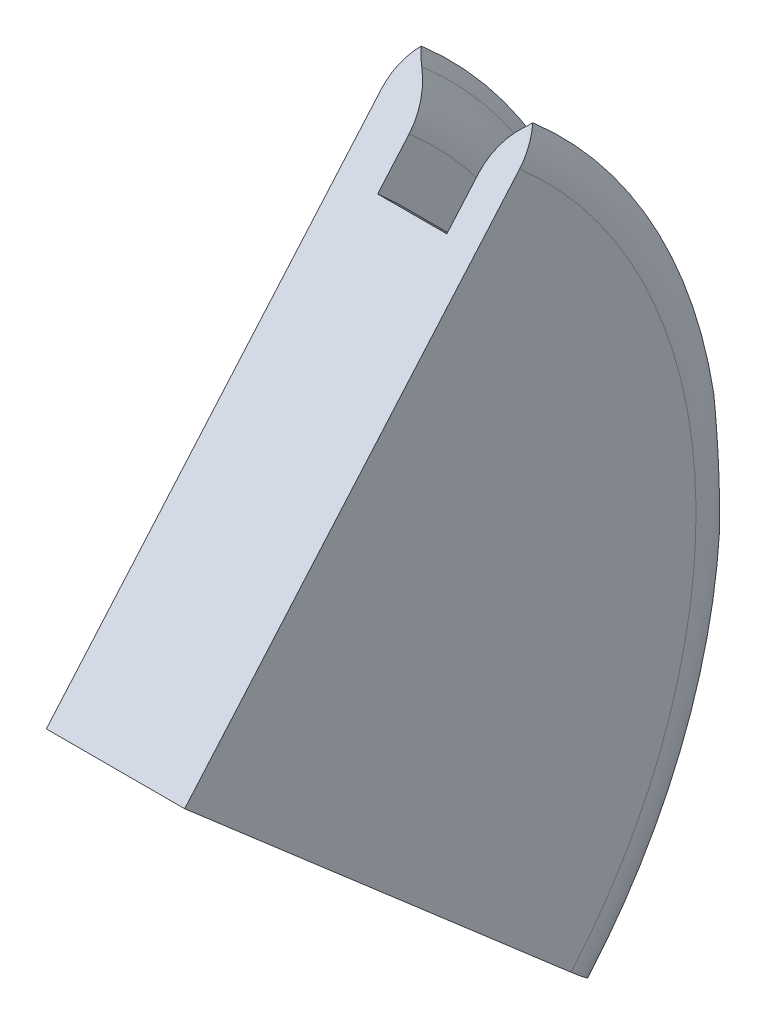
ISO-10303-21;
HEADER;
FILE_DESCRIPTION(('STEP AP214'),'2;1');
FILE_NAME('part.step','',(''),(''),'','','');
FILE_SCHEMA(('AUTOMOTIVE_DESIGN { 1 0 10303 214 1 1 1 1 }'));
ENDSEC;
DATA;
#1=APPLICATION_CONTEXT('core data for automotive mechanical design processes');
#2=APPLICATION_PROTOCOL_DEFINITION('international standard','automotive_design',2000,#1);
#3=PRODUCT_CONTEXT('',#1,'mechanical');
#4=PRODUCT('Part','Part','',(#3));
#5=PRODUCT_RELATED_PRODUCT_CATEGORY('part','',(#4));
#6=PRODUCT_DEFINITION_FORMATION('','',#4);
#7=PRODUCT_DEFINITION_CONTEXT('part definition',#1,'design');
#8=PRODUCT_DEFINITION('design','',#6,#7);
#9=PRODUCT_DEFINITION_SHAPE('','',#8);
#10=(LENGTH_UNIT() NAMED_UNIT(*) SI_UNIT(.MILLI.,.METRE.));
#11=(NAMED_UNIT(*) PLANE_ANGLE_UNIT() SI_UNIT($,.RADIAN.));
#12=(NAMED_UNIT(*) SI_UNIT($,.STERADIAN.) SOLID_ANGLE_UNIT());
#13=UNCERTAINTY_MEASURE_WITH_UNIT(LENGTH_MEASURE(1.E-05),#10,'distance_accuracy_value','');
#14=(GEOMETRIC_REPRESENTATION_CONTEXT(3) GLOBAL_UNCERTAINTY_ASSIGNED_CONTEXT((#13)) GLOBAL_UNIT_ASSIGNED_CONTEXT((#10,
#11,#12)) REPRESENTATION_CONTEXT('',''));
#15=CARTESIAN_POINT('',(0.,0.,0.));
#16=DIRECTION('',(0.,0.,1.));
#17=DIRECTION('',(1.,0.,0.));
#18=AXIS2_PLACEMENT_3D('',#15,#16,#17);
#19=CARTESIAN_POINT('',(1.,0.,-5.5));
#20=DIRECTION('',(-1.,0.,0.));
#21=DIRECTION('',(0.,0.,1.));
#22=AXIS2_PLACEMENT_3D('',#19,#20,#21);
#23=PLANE('',#22);
#24=DIRECTION('',(0.,-0.654830277613881,-0.755775963841221));
#25=VECTOR('',#24,1.);
#26=CARTESIAN_POINT('',(1.,0.,0.));
#27=LINE('',#26,#25);
#28=CARTESIAN_POINT('',(1.,0.,0.));
#29=VERTEX_POINT('',#28);
#30=CARTESIAN_POINT('',(1.,-4.8426368442274,-5.58915592879328));
#31=VERTEX_POINT('',#30);
#32=EDGE_CURVE('E144',#29,#31,#27,.T.);
#33=ORIENTED_EDGE('',*,*,#32,.T.);
#34=CARTESIAN_POINT('',(1.,0.,0.));
#35=DIRECTION('',(-1.,0.,0.));
#36=DIRECTION('',(0.,0.,1.));
#37=AXIS2_PLACEMENT_3D('',#34,#35,#36);
#38=CIRCLE('',#37,7.39525493823125);
#39=CARTESIAN_POINT('',(1.,5.58915592879328,-4.8426368442274));
#40=VERTEX_POINT('',#39);
#41=EDGE_CURVE('E152',#40,#31,#38,.T.);
#42=ORIENTED_EDGE('',*,*,#41,.F.);
#43=DIRECTION('',(0.,-0.755775963841221,0.654830277613881));
#44=VECTOR('',#43,1.);
#45=CARTESIAN_POINT('',(1.,0.,0.));
#46=LINE('',#45,#44);
#47=EDGE_CURVE('E135',#40,#29,#46,.T.);
#48=ORIENTED_EDGE('',*,*,#47,.T.);
#49=EDGE_LOOP('',(#33,#42,#48));
#50=FACE_BOUND('',#49,.T.);
#51=ADVANCED_FACE('F33',(#50),#23,.F.);
#52=CARTESIAN_POINT('',(0.,0.,0.));
#53=DIRECTION('',(-1.,0.,0.));
#54=DIRECTION('',(0.,0.,1.));
#55=AXIS2_PLACEMENT_3D('',#52,#53,#54);
#56=TOROIDAL_SURFACE('',#55,7.39525493823125,1.);
#57=CARTESIAN_POINT('',(0.,-4.8426368442274,-5.58915592879328));
#58=DIRECTION('',(0.,-0.755775963841221,0.654830277613881));
#59=DIRECTION('',(0.,-0.654830277613881,-0.755775963841221));
#60=AXIS2_PLACEMENT_3D('',#57,#58,#59);
#61=CIRCLE('',#60,1.);
#62=CARTESIAN_POINT('',(0.877568028732645,-5.1565966224364,-5.95151433232941));
#63=VERTEX_POINT('',#62);
#64=EDGE_CURVE('E147',#63,#31,#61,.T.);
#65=ORIENTED_EDGE('',*,*,#64,.F.);
#66=CARTESIAN_POINT('',(0.877568028732645,0.,0.));
#67=DIRECTION('',(-1.,0.,0.));
#68=DIRECTION('',(0.,0.,1.));
#69=AXIS2_PLACEMENT_3D('',#66,#67,#68);
#70=CIRCLE('',#69,7.87470707864393);
#71=CARTESIAN_POINT('',(0.877568028732645,-0.492579679672405,-7.8592860256908));
#72=VERTEX_POINT('',#71);
#73=EDGE_CURVE('E392',#72,#63,#70,.T.);
#74=ORIENTED_EDGE('',*,*,#73,.F.);
#75=CARTESIAN_POINT('',(0.87124643016858,1.36047049335151,-7.7678636593847));
#76=CARTESIAN_POINT('',(0.87689525662377,1.27932034625772,-7.77186729543374));
#77=CARTESIAN_POINT('',(0.881655211863749,1.19811323072609,-7.77587374208633));
#78=CARTESIAN_POINT('',(0.889610069218217,1.03562890798068,-7.78389009344545));
#79=CARTESIAN_POINT('',(0.89280510642261,0.954351707423906,-7.78789999782354));
#80=CARTESIAN_POINT('',(0.897841116256696,0.791841019593601,-7.79591764993451));
#81=CARTESIAN_POINT('',(0.899683484312146,0.71060757390222,-7.79992539561589));
#82=CARTESIAN_POINT('',(0.90212711177362,0.548119210673442,-7.80794194631691));
#83=CARTESIAN_POINT('',(0.902728324601951,0.466864292444669,-7.81195075137066));
#84=CARTESIAN_POINT('',(0.902728324602001,0.304354455987123,-7.81996836147818));
#85=CARTESIAN_POINT('',(0.90212711177372,0.22309953775835,-7.82397716653193));
#86=CARTESIAN_POINT('',(0.899683484312349,0.0606111745295715,-7.83199371723295));
#87=CARTESIAN_POINT('',(0.897841116256951,-0.0206222711618097,-7.83600146291433));
#88=CARTESIAN_POINT('',(0.892805106422974,-0.183132958992117,-7.8440191150253));
#89=CARTESIAN_POINT('',(0.889610069218637,-0.26441015954889,-7.84802901940339));
#90=CARTESIAN_POINT('',(0.881655211864308,-0.42689448229431,-7.85604537076251));
#91=CARTESIAN_POINT('',(0.876895256624411,-0.508101597825946,-7.8600518174151));
#92=CARTESIAN_POINT('',(0.871246430169328,-0.58925174491974,-7.86405545346414));
#93=B_SPLINE_CURVE_WITH_KNOTS('',3,(#75,#76,#77,#78,#79,#80,#81,#82,#83,#84,#85,#86,#87,#88,#89,
#90,#91,#92),.UNSPECIFIED.,.F.,.F.,(4,2,2,2,2,2,2,2,4),(0.,0.244323144300059,0.488625193942552,
0.732674863895539,0.976733692303172,1.2207925207108,1.46484219066379,1.70914424030628,
1.95346738460634),.UNSPECIFIED.);
#94=CARTESIAN_POINT('',(0.877568028732645,1.26379842809418,-7.77263308715853));
#95=VERTEX_POINT('',#94);
#96=EDGE_CURVE('E52',#95,#72,#93,.T.);
#97=ORIENTED_EDGE('',*,*,#96,.F.);
#98=CARTESIAN_POINT('',(0.877568028732645,5.95151433232941,-5.1565966224364));
#99=VERTEX_POINT('',#98);
#100=EDGE_CURVE('E393',#99,#95,#70,.T.);
#101=ORIENTED_EDGE('',*,*,#100,.F.);
#102=CARTESIAN_POINT('',(0.,5.58915592879328,-4.8426368442274));
#103=DIRECTION('',(0.,0.654830277613881,0.755775963841221));
#104=DIRECTION('',(0.,-0.755775963841221,0.654830277613881));
#105=AXIS2_PLACEMENT_3D('',#102,#103,#104);
#106=CIRCLE('',#105,1.);
#107=EDGE_CURVE('E171',#40,#99,#106,.T.);
#108=ORIENTED_EDGE('',*,*,#107,.F.);
#109=ORIENTED_EDGE('',*,*,#41,.T.);
#110=EDGE_LOOP('',(#65,#74,#97,#101,#108,#109));
#111=FACE_BOUND('',#110,.T.);
#112=ADVANCED_FACE('F224',(#111),#56,.T.);
#113=CARTESIAN_POINT('',(0.0695358378138631,0.,-8.46737662771084));
#114=DIRECTION('',(0.,-1.,0.));
#115=DIRECTION('',(-1.,0.,0.));
#116=AXIS2_PLACEMENT_3D('',#113,#114,#115);
#117=ELLIPSE('',#116,1.00231530269301,1.00165572376594);
#118=CARTESIAN_POINT('',(0.,0.,0.));
#119=DIRECTION('',(-1.,0.,0.));
#120=AXIS1_PLACEMENT('',#118,#119);
#121=SURFACE_OF_REVOLUTION('',#117,#120);
#122=CARTESIAN_POINT('',(0.0695358378138631,-5.54469458778518,-6.39943973201479));
#123=DIRECTION('',(0.,-0.755775963841221,0.654830277613881));
#124=DIRECTION('',(-1.,0.,0.));
#125=AXIS2_PLACEMENT_3D('',#122,#123,#124);
#126=ELLIPSE('',#125,1.00231530269301,1.00165572376594);
#127=CARTESIAN_POINT('',(0.820511390920018,-5.11028396078751,-5.89806231935394));
#128=VERTEX_POINT('',#127);
#129=EDGE_CURVE('E187',#128,#63,#126,.F.);
#130=ORIENTED_EDGE('',*,*,#129,.F.);
#131=CARTESIAN_POINT('',(0.820511390920018,0.,0.));
#132=DIRECTION('',(-1.,0.,0.));
#133=DIRECTION('',(0.,0.,1.));
#134=AXIS2_PLACEMENT_3D('',#131,#132,#133);
#135=CIRCLE('',#134,7.80398239893356);
#136=CARTESIAN_POINT('',(0.820511390920018,5.89806231935394,-5.11028396078751));
#137=VERTEX_POINT('',#136);
#138=EDGE_CURVE('E389',#137,#128,#135,.T.);
#139=ORIENTED_EDGE('',*,*,#138,.F.);
#140=CARTESIAN_POINT('',(0.0695358378138631,6.3994397320148,-5.54469458778518));
#141=DIRECTION('',(0.,-0.654830277613881,-0.755775963841221));
#142=DIRECTION('',(-1.,0.,0.));
#143=AXIS2_PLACEMENT_3D('',#140,#141,#142);
#144=ELLIPSE('',#143,1.00231530269301,1.00165572376594);
#145=EDGE_CURVE('E169',#99,#137,#144,.T.);
#146=ORIENTED_EDGE('',*,*,#145,.F.);
#147=ORIENTED_EDGE('',*,*,#100,.T.);
#148=CARTESIAN_POINT('',(0.877568028732645,-0.492579679672405,-7.8592860256908));
#149=CARTESIAN_POINT('',(0.871553198293696,-0.419436140976986,-7.85567740489635));
#150=CARTESIAN_POINT('',(0.866101869850448,-0.346242026404169,-7.85206628888269));
#151=CARTESIAN_POINT('',(0.856549122926929,-0.199865082226794,-7.84484461361228));
#152=CARTESIAN_POINT('',(0.852445906233175,-0.126682368806276,-7.84123406008761));
#153=CARTESIAN_POINT('',(0.845798291466642,0.0196833250528321,-7.83401293986462));
#154=CARTESIAN_POINT('',(0.843252364136757,0.0928662344293052,-7.83040237667224));
#155=CARTESIAN_POINT('',(0.839843491625534,0.239235900173038,-7.82318106049174));
#156=CARTESIAN_POINT('',(0.838979724797239,0.312422637191963,-7.8195703084582));
#157=CARTESIAN_POINT('',(0.83897972479724,0.458796111229812,-7.81234880439113));
#158=CARTESIAN_POINT('',(0.839843491625534,0.531982848248737,-7.80873805235759));
#159=CARTESIAN_POINT('',(0.843252364136757,0.67835251399247,-7.8015167361771));
#160=CARTESIAN_POINT('',(0.84579829146664,0.751535423368943,-7.79790617298471));
#161=CARTESIAN_POINT('',(0.852445906233174,0.897901117228051,-7.79068505276172));
#162=CARTESIAN_POINT('',(0.856549122926929,0.971083830648569,-7.78707449923705));
#163=CARTESIAN_POINT('',(0.866101869850449,1.11746077482594,-7.77985282396665));
#164=CARTESIAN_POINT('',(0.871553198293698,1.19065488939876,-7.77624170795298));
#165=CARTESIAN_POINT('',(0.877568028732644,1.26379842809418,-7.77263308715853));
#166=B_SPLINE_CURVE_WITH_KNOTS('',3,(#148,#149,#150,#151,#152,#153,#154,#155,#156,#157,#158,
#159,#160,#161,#162,#163,#164,#165),.UNSPECIFIED.,.F.,.F.,(4,2,2,2,2,2,2,2,4),(0.,
0.220441677264283,0.440588107538709,0.660518005639352,0.880340452579075,1.1001628995188,
1.32009279761944,1.54023922789387,1.76068090515815),.UNSPECIFIED.);
#167=EDGE_CURVE('E196',#72,#95,#166,.T.);
#168=ORIENTED_EDGE('',*,*,#167,.F.);
#169=ORIENTED_EDGE('',*,*,#73,.T.);
#170=EDGE_LOOP('',(#130,#139,#146,#147,#168,#169));
#171=FACE_BOUND('',#170,.T.);
#172=ADVANCED_FACE('F227',(#171),#121,.T.);
#173=CARTESIAN_POINT('',(1.56953583781389,0.,0.));
#174=DIRECTION('',(-1.,0.,0.));
#175=DIRECTION('',(0.,0.,1.));
#176=AXIS2_PLACEMENT_3D('',#173,#174,#175);
#177=TOROIDAL_SURFACE('',#176,7.14144003956676,1.);
#178=CARTESIAN_POINT('',(1.56953583781389,-4.67643116367239,-5.39732872911786));
#179=DIRECTION('',(0.,-0.755775963841221,0.654830277613881));
#180=DIRECTION('',(0.,-0.654830277613881,-0.755775963841221));
#181=AXIS2_PLACEMENT_3D('',#178,#179,#180);
#182=CIRCLE('',#181,1.);
#183=CARTESIAN_POINT('',(0.569535837813887,-4.67643116367239,-5.39732872911786));
#184=VERTEX_POINT('',#183);
#185=EDGE_CURVE('E185',#184,#128,#182,.T.);
#186=ORIENTED_EDGE('',*,*,#185,.F.);
#187=CARTESIAN_POINT('',(0.569535837813887,0.,0.));
#188=DIRECTION('',(-1.,0.,0.));
#189=DIRECTION('',(0.,0.,1.));
#190=AXIS2_PLACEMENT_3D('',#187,#188,#189);
#191=CIRCLE('',#190,7.14144003956676);
#192=CARTESIAN_POINT('',(0.569535837813887,5.39732872911786,-4.67643116367239));
#193=VERTEX_POINT('',#192);
#194=EDGE_CURVE('E386',#193,#184,#191,.T.);
#195=ORIENTED_EDGE('',*,*,#194,.F.);
#196=CARTESIAN_POINT('',(1.56953583781389,5.39732872911786,-4.67643116367239));
#197=DIRECTION('',(0.,0.654830277613881,0.755775963841221));
#198=DIRECTION('',(0.,-0.755775963841221,0.654830277613881));
#199=AXIS2_PLACEMENT_3D('',#196,#197,#198);
#200=CIRCLE('',#199,1.);
#201=EDGE_CURVE('E167',#137,#193,#200,.T.);
#202=ORIENTED_EDGE('',*,*,#201,.F.);
#203=ORIENTED_EDGE('',*,*,#138,.T.);
#204=EDGE_LOOP('',(#186,#195,#202,#203));
#205=FACE_BOUND('',#204,.T.);
#206=ADVANCED_FACE('F232',(#205),#177,.T.);
#207=CARTESIAN_POINT('',(0.569535837813887,0.,-7.14144003956676));
#208=DIRECTION('',(1.,0.,0.));
#209=DIRECTION('',(0.,0.,-1.));
#210=AXIS2_PLACEMENT_3D('',#207,#208,#209);
#211=PLANE('',#210);
#212=DIRECTION('',(0.,-0.654830277613881,-0.755775963841221));
#213=VECTOR('',#212,1.);
#214=CARTESIAN_POINT('',(0.569535837813887,-3.53433427006162,-4.07917132241696));
#215=LINE('',#214,#213);
#216=CARTESIAN_POINT('',(0.569535837813887,-4.22210168555187,-4.87296186496));
#217=VERTEX_POINT('',#216);
#218=EDGE_CURVE('E183',#217,#184,#215,.T.);
#219=ORIENTED_EDGE('',*,*,#218,.F.);
#220=CARTESIAN_POINT('',(0.569535837813887,0.,0.));
#221=DIRECTION('',(-1.,0.,0.));
#222=DIRECTION('',(0.,0.,1.));
#223=AXIS2_PLACEMENT_3D('',#220,#221,#222);
#224=CIRCLE('',#223,6.44762746911563);
#225=CARTESIAN_POINT('',(0.569535837813887,4.87296186496,-4.22210168555187));
#226=VERTEX_POINT('',#225);
#227=EDGE_CURVE('E383',#226,#217,#224,.T.);
#228=ORIENTED_EDGE('',*,*,#227,.F.);
#229=DIRECTION('',(0.,-0.755775963841221,0.654830277613881));
#230=VECTOR('',#229,1.);
#231=CARTESIAN_POINT('',(0.569535837813887,3.53433427006162,-3.0622687171498));
#232=LINE('',#231,#230);
#233=EDGE_CURVE('E165',#193,#226,#232,.T.);
#234=ORIENTED_EDGE('',*,*,#233,.F.);
#235=ORIENTED_EDGE('',*,*,#194,.T.);
#236=EDGE_LOOP('',(#219,#228,#234,#235));
#237=FACE_BOUND('',#236,.T.);
#238=ADVANCED_FACE('F236',(#237),#211,.F.);
#239=CARTESIAN_POINT('',(0.,0.,0.));
#240=DIRECTION('',(-1.,0.,0.));
#241=DIRECTION('',(0.,0.,1.));
#242=AXIS2_PLACEMENT_3D('',#239,#240,#241);
#243=CYLINDRICAL_SURFACE('',#242,6.44762746911563);
#244=DIRECTION('',(-1.,0.,0.));
#245=VECTOR('',#244,1.);
#246=CARTESIAN_POINT('',(0.,-4.22210168555187,-4.87296186496));
#247=LINE('',#246,#245);
#248=CARTESIAN_POINT('',(-0.430464162186113,-4.22210168555187,-4.87296186496));
#249=VERTEX_POINT('',#248);
#250=EDGE_CURVE('E181',#249,#217,#247,.F.);
#251=ORIENTED_EDGE('',*,*,#250,.F.);
#252=CARTESIAN_POINT('',(-0.430464162186113,0.,0.));
#253=DIRECTION('',(-1.,0.,0.));
#254=DIRECTION('',(0.,0.,1.));
#255=AXIS2_PLACEMENT_3D('',#252,#253,#254);
#256=CIRCLE('',#255,6.44762746911563);
#257=CARTESIAN_POINT('',(-0.430464162186113,4.87296186496,-4.22210168555187));
#258=VERTEX_POINT('',#257);
#259=EDGE_CURVE('E380',#258,#249,#256,.T.);
#260=ORIENTED_EDGE('',*,*,#259,.F.);
#261=DIRECTION('',(-1.,0.,0.));
#262=VECTOR('',#261,1.);
#263=CARTESIAN_POINT('',(0.,4.87296186496,-4.22210168555187));
#264=LINE('',#263,#262);
#265=EDGE_CURVE('E163',#226,#258,#264,.T.);
#266=ORIENTED_EDGE('',*,*,#265,.F.);
#267=ORIENTED_EDGE('',*,*,#227,.T.);
#268=EDGE_LOOP('',(#251,#260,#266,#267));
#269=FACE_BOUND('',#268,.T.);
#270=ADVANCED_FACE('F240',(#269),#243,.T.);
#271=CARTESIAN_POINT('',(-0.430464162186113,0.,-7.14144003956671));
#272=DIRECTION('',(-1.,0.,0.));
#273=DIRECTION('',(0.,0.,1.));
#274=AXIS2_PLACEMENT_3D('',#271,#272,#273);
#275=PLANE('',#274);
#276=DIRECTION('',(0.,0.654830277613881,0.755775963841221));
#277=VECTOR('',#276,1.);
#278=CARTESIAN_POINT('',(-0.430464162186113,-3.5343342700616,-4.07917132241693));
#279=LINE('',#278,#277);
#280=CARTESIAN_POINT('',(-0.430464162186113,-4.67643116367235,-5.39732872911782));
#281=VERTEX_POINT('',#280);
#282=EDGE_CURVE('E179',#281,#249,#279,.T.);
#283=ORIENTED_EDGE('',*,*,#282,.F.);
#284=CARTESIAN_POINT('',(-0.430464162186113,0.,0.));
#285=DIRECTION('',(-1.,0.,0.));
#286=DIRECTION('',(0.,0.,1.));
#287=AXIS2_PLACEMENT_3D('',#284,#285,#286);
#288=CIRCLE('',#287,7.14144003956671);
#289=CARTESIAN_POINT('',(-0.430464162186113,5.39732872911782,-4.67643116367235));
#290=VERTEX_POINT('',#289);
#291=EDGE_CURVE('E377',#290,#281,#288,.T.);
#292=ORIENTED_EDGE('',*,*,#291,.F.);
#293=DIRECTION('',(0.,0.755775963841221,-0.654830277613881));
#294=VECTOR('',#293,1.);
#295=CARTESIAN_POINT('',(-0.430464162186113,3.5343342700616,-3.06226871714977));
#296=LINE('',#295,#294);
#297=EDGE_CURVE('E161',#258,#290,#296,.T.);
#298=ORIENTED_EDGE('',*,*,#297,.F.);
#299=ORIENTED_EDGE('',*,*,#259,.T.);
#300=EDGE_LOOP('',(#283,#292,#298,#299));
#301=FACE_BOUND('',#300,.T.);
#302=ADVANCED_FACE('F244',(#301),#275,.F.);
#303=CARTESIAN_POINT('',(-1.43046416218611,0.,0.));
#304=DIRECTION('',(-1.,0.,0.));
#305=DIRECTION('',(0.,0.,1.));
#306=AXIS2_PLACEMENT_3D('',#303,#304,#305);
#307=TOROIDAL_SURFACE('',#306,7.14144003956671,1.);
#308=CARTESIAN_POINT('',(-1.43046416218611,-4.67643116367235,-5.39732872911782));
#309=DIRECTION('',(0.,-0.755775963841221,0.654830277613881));
#310=DIRECTION('',(0.,-0.654830277613881,-0.755775963841221));
#311=AXIS2_PLACEMENT_3D('',#308,#309,#310);
#312=CIRCLE('',#311,1.);
#313=CARTESIAN_POINT('',(-0.681439715292268,-5.11028396078749,-5.89806231935392));
#314=VERTEX_POINT('',#313);
#315=EDGE_CURVE('E177',#314,#281,#312,.T.);
#316=ORIENTED_EDGE('',*,*,#315,.F.);
#317=CARTESIAN_POINT('',(-0.681439715292268,0.,0.));
#318=DIRECTION('',(-1.,0.,0.));
#319=DIRECTION('',(0.,0.,1.));
#320=AXIS2_PLACEMENT_3D('',#317,#318,#319);
#321=CIRCLE('',#320,7.80398239893354);
#322=CARTESIAN_POINT('',(-0.681439715292268,5.89806231935392,-5.11028396078749));
#323=VERTEX_POINT('',#322);
#324=EDGE_CURVE('E372',#323,#314,#321,.T.);
#325=ORIENTED_EDGE('',*,*,#324,.F.);
#326=CARTESIAN_POINT('',(-1.43046416218611,5.39732872911782,-4.67643116367235));
#327=DIRECTION('',(0.,0.654830277613881,0.755775963841221));
#328=DIRECTION('',(0.,-0.755775963841221,0.654830277613881));
#329=AXIS2_PLACEMENT_3D('',#326,#327,#328);
#330=CIRCLE('',#329,1.);
#331=EDGE_CURVE('E159',#290,#323,#330,.T.);
#332=ORIENTED_EDGE('',*,*,#331,.F.);
#333=ORIENTED_EDGE('',*,*,#291,.T.);
#334=EDGE_LOOP('',(#316,#325,#332,#333));
#335=FACE_BOUND('',#334,.T.);
#336=ADVANCED_FACE('F247',(#335),#307,.T.);
#337=CARTESIAN_POINT('',(0.0695358378138631,0.,-8.46737662771084));
#338=DIRECTION('',(0.,-1.,0.));
#339=DIRECTION('',(-1.,0.,0.));
#340=AXIS2_PLACEMENT_3D('',#337,#338,#339);
#341=ELLIPSE('',#340,1.00231530269301,1.00165572376594);
#342=CARTESIAN_POINT('',(0.,0.,0.));
#343=DIRECTION('',(-1.,0.,0.));
#344=AXIS1_PLACEMENT('',#342,#343);
#345=SURFACE_OF_REVOLUTION('',#341,#344);
#346=CARTESIAN_POINT('',(0.0695358378138631,-5.54469458778518,-6.39943973201479));
#347=DIRECTION('',(0.,-0.755775963841221,0.654830277613881));
#348=DIRECTION('',(-1.,0.,0.));
#349=AXIS2_PLACEMENT_3D('',#346,#347,#348);
#350=ELLIPSE('',#349,1.00231530269301,1.00165572376594);
#351=CARTESIAN_POINT('',(-0.808333839623956,-5.22815139793252,-6.03409966973176));
#352=VERTEX_POINT('',#351);
#353=EDGE_CURVE('E175',#352,#314,#350,.F.);
#354=ORIENTED_EDGE('',*,*,#353,.F.);
#355=CARTESIAN_POINT('',(-0.808333839623956,0.,0.));
#356=DIRECTION('',(-1.,0.,0.));
#357=DIRECTION('',(0.,0.,1.));
#358=AXIS2_PLACEMENT_3D('',#355,#356,#357);
#359=CIRCLE('',#358,7.98397932512107);
#360=CARTESIAN_POINT('',(-0.808333839623956,-1.19550495924482,-7.8939656546239));
#361=VERTEX_POINT('',#360);
#362=EDGE_CURVE('E368',#361,#352,#359,.T.);
#363=ORIENTED_EDGE('',*,*,#362,.F.);
#364=CARTESIAN_POINT('',(-0.808333839623956,1.96672370766659,-7.73795345822543));
#365=CARTESIAN_POINT('',(-0.799225940673019,1.8834926364206,-7.74205975906621));
#366=CARTESIAN_POINT('',(-0.790196170079058,1.80025397524145,-7.7461664343651));
#367=CARTESIAN_POINT('',(-0.772757282523396,1.63369662425601,-7.75438373326743));
#368=CARTESIAN_POINT('',(-0.764348282284958,1.55037792236811,-7.75849435746695));
#369=CARTESIAN_POINT('',(-0.740738563938678,1.30008226188313,-7.770842982394));
#370=CARTESIAN_POINT('',(-0.727175487457708,1.13293430139492,-7.77908941969696));
#371=CARTESIAN_POINT('',(-0.712509228339806,0.882347059901155,-7.79145243010919));
#372=CARTESIAN_POINT('',(-0.708570063748859,0.799075412770033,-7.79556073280803));
#373=CARTESIAN_POINT('',(-0.702798445698996,0.632460742048265,-7.80378085964563));
#374=CARTESIAN_POINT('',(-0.70096590988285,0.549117721375407,-7.80789268364044));
#375=CARTESIAN_POINT('',(-0.69953769570409,0.382456948720617,-7.81611508497004));
#376=CARTESIAN_POINT('',(-0.699940814505158,0.299139207265462,-7.82022566178549));
#377=CARTESIAN_POINT('',(-0.7029514645303,0.132545475045548,-7.82844475559799));
#378=CARTESIAN_POINT('',(-0.705558971218302,0.049269483826407,-7.83255327261744));
#379=CARTESIAN_POINT('',(-0.713399321310838,-0.130865461661448,-7.84144043779552));
#380=CARTESIAN_POINT('',(-0.718993066737837,-0.227708512771794,-7.84621830135347));
#381=CARTESIAN_POINT('',(-0.732450948132709,-0.421257113744793,-7.85576724468689));
#382=CARTESIAN_POINT('',(-0.740315660345223,-0.51796262244027,-7.86053832243133));
#383=CARTESIAN_POINT('',(-0.757714310139335,-0.711550329006971,-7.87008919508422));
#384=CARTESIAN_POINT('',(-0.767253829315249,-0.808432010555418,-7.87486896451931));
#385=CARTESIAN_POINT('',(-0.787268668300944,-1.00205058426757,-7.88442136003873));
#386=CARTESIAN_POINT('',(-0.797743512903214,-1.09878752485236,-7.88919398851198));
#387=CARTESIAN_POINT('',(-0.808333839624694,-1.19550495924479,-7.89396565462526));
#388=B_SPLINE_CURVE_WITH_KNOTS('',3,(#364,#365,#366,#367,#368,#369,#370,#371,#372,#373,#374,
#375,#376,#377,#378,#379,#380,#381,#382,#383,#384,#385,#386,#387),.UNSPECIFIED.,.F.,.F.,(4,2,2,
2,2,2,2,2,2,2,2,4),(0.,0.251482485274088,0.503012136915268,1.00658132662157,1.25695567071183,
1.50732022625311,1.75755009267366,2.00777717393232,2.29910913858479,2.59051509209116,
2.88291131077732,3.17515980894881),.UNSPECIFIED.);
#389=CARTESIAN_POINT('',(-0.808333839623958,1.96672370766659,-7.73795345822543));
#390=VERTEX_POINT('',#389);
#391=EDGE_CURVE('E58',#390,#361,#388,.T.);
#392=ORIENTED_EDGE('',*,*,#391,.F.);
#393=CARTESIAN_POINT('',(-0.808333839623956,6.03409966973176,-5.22815139793252));
#394=VERTEX_POINT('',#393);
#395=EDGE_CURVE('E370',#394,#390,#359,.T.);
#396=ORIENTED_EDGE('',*,*,#395,.F.);
#397=CARTESIAN_POINT('',(0.0695358378138631,6.3994397320148,-5.54469458778518));
#398=DIRECTION('',(0.,-0.654830277613881,-0.755775963841221));
#399=DIRECTION('',(-1.,0.,0.));
#400=AXIS2_PLACEMENT_3D('',#397,#398,#399);
#401=ELLIPSE('',#400,1.00231530269301,1.00165572376594);
#402=EDGE_CURVE('E157',#323,#394,#401,.T.);
#403=ORIENTED_EDGE('',*,*,#402,.F.);
#404=ORIENTED_EDGE('',*,*,#324,.T.);
#405=EDGE_LOOP('',(#354,#363,#392,#396,#403,#404));
#406=FACE_BOUND('',#405,.T.);
#407=ADVANCED_FACE('F203',(#406),#345,.T.);
#408=CARTESIAN_POINT('',(0.,0.,0.));
#409=DIRECTION('',(-1.,0.,0.));
#410=DIRECTION('',(0.,0.,1.));
#411=AXIS2_PLACEMENT_3D('',#408,#409,#410);
#412=TOROIDAL_SURFACE('',#411,7.39525493823125,1.);
#413=CARTESIAN_POINT('',(0.,-4.8426368442274,-5.58915592879328));
#414=DIRECTION('',(0.,-0.755775963841221,0.654830277613881));
#415=DIRECTION('',(0.,-0.654830277613881,-0.755775963841221));
#416=AXIS2_PLACEMENT_3D('',#413,#414,#415);
#417=CIRCLE('',#416,1.);
#418=CARTESIAN_POINT('',(-1.,-4.8426368442274,-5.58915592879328));
#419=VERTEX_POINT('',#418);
#420=EDGE_CURVE('E173',#419,#352,#417,.T.);
#421=ORIENTED_EDGE('',*,*,#420,.F.);
#422=CARTESIAN_POINT('',(-1.,0.,0.));
#423=DIRECTION('',(-1.,0.,0.));
#424=DIRECTION('',(0.,0.,1.));
#425=AXIS2_PLACEMENT_3D('',#422,#423,#424);
#426=CIRCLE('',#425,7.39525493823125);
#427=CARTESIAN_POINT('',(-1.,5.58915592879328,-4.8426368442274));
#428=VERTEX_POINT('',#427);
#429=EDGE_CURVE('E222',#428,#419,#426,.T.);
#430=ORIENTED_EDGE('',*,*,#429,.F.);
#431=CARTESIAN_POINT('',(0.,5.58915592879328,-4.8426368442274));
#432=DIRECTION('',(0.,0.654830277613881,0.755775963841221));
#433=DIRECTION('',(0.,-0.755775963841221,0.654830277613881));
#434=AXIS2_PLACEMENT_3D('',#431,#432,#433);
#435=CIRCLE('',#434,1.);
#436=EDGE_CURVE('E140',#394,#428,#435,.T.);
#437=ORIENTED_EDGE('',*,*,#436,.F.);
#438=ORIENTED_EDGE('',*,*,#395,.T.);
#439=CARTESIAN_POINT('',(-0.798550531605155,-1.26072464318106,-7.89718334290994));
#440=CARTESIAN_POINT('',(-0.811437460676355,-1.1776407153415,-7.89308430155873));
#441=CARTESIAN_POINT('',(-0.822634900241271,-1.09431845508896,-7.8889735018032));
#442=CARTESIAN_POINT('',(-0.842222782208875,-0.927373071768367,-7.88073705887832));
#443=CARTESIAN_POINT('',(-0.850614251026048,-0.843750070049185,-7.87661142169586));
#444=CARTESIAN_POINT('',(-0.86516495943053,-0.67638475929867,-7.86835426116718));
#445=CARTESIAN_POINT('',(-0.871325975286882,-0.59264259875951,-7.86422274514698));
#446=CARTESIAN_POINT('',(-0.881800771650777,-0.425036221125767,-7.85595369130573));
#447=CARTESIAN_POINT('',(-0.886114353567666,-0.341171991881134,-7.85181615288524));
#448=CARTESIAN_POINT('',(-0.896693197327975,-0.0903271000093297,-7.83944043099461));
#449=CARTESIAN_POINT('',(-0.900663443708322,0.0767505871190518,-7.83119746070887));
#450=CARTESIAN_POINT('',(-0.903564638292659,0.410993758284072,-7.81470718857571));
#451=CARTESIAN_POINT('',(-0.902494048622499,0.578159253554912,-7.80645988617404));
#452=CARTESIAN_POINT('',(-0.896318827461128,0.85269386102278,-7.79291540485724));
#453=CARTESIAN_POINT('',(-0.892791347537769,0.960098340035579,-7.78761648107947));
#454=CARTESIAN_POINT('',(-0.883119316421704,1.1747563959786,-7.77702607845214));
#455=CARTESIAN_POINT('',(-0.876975660911344,1.28201001196172,-7.77173459767584));
#456=CARTESIAN_POINT('',(-0.861410299908334,1.49663168112383,-7.76114599023229));
#457=CARTESIAN_POINT('',(-0.851978325124693,1.60399902979446,-7.75584889832276));
#458=CARTESIAN_POINT('',(-0.834622725490136,1.76474704330866,-7.74791820978101));
#459=CARTESIAN_POINT('',(-0.828299839581682,1.81829995448737,-7.74527611517731));
#460=CARTESIAN_POINT('',(-0.814405846305948,1.92525133774303,-7.73999954540101));
#461=CARTESIAN_POINT('',(-0.806834554584384,1.97864978582331,-7.73736507141232));
#462=CARTESIAN_POINT('',(-0.798550531605164,2.03194339160284,-7.73473576993939));
#463=B_SPLINE_CURVE_WITH_KNOTS('',3,(#439,#440,#441,#442,#443,#444,#445,#446,#447,#448,#449,
#450,#451,#452,#453,#454,#455,#456,#457,#458,#459,#460,#461,#462),.UNSPECIFIED.,.F.,.F.,(4,2,2,
2,2,2,2,2,2,2,2,4),(0.,0.252481594320089,0.504870730446119,0.757058426617587,1.00927322500669,
1.51115912090911,2.01319814366181,2.33595137319092,2.65859419260618,2.9822537745483,
3.14420942511539,3.30618901341309),.UNSPECIFIED.);
#464=EDGE_CURVE('E12',#361,#390,#463,.T.);
#465=ORIENTED_EDGE('',*,*,#464,.F.);
#466=ORIENTED_EDGE('',*,*,#362,.T.);
#467=EDGE_LOOP('',(#421,#430,#437,#438,#465,#466));
#468=FACE_BOUND('',#467,.T.);
#469=ADVANCED_FACE('F254',(#468),#412,.T.);
#470=CARTESIAN_POINT('',(-1.,0.,-5.5));
#471=DIRECTION('',(1.,0.,0.));
#472=DIRECTION('',(0.,0.,-1.));
#473=AXIS2_PLACEMENT_3D('',#470,#471,#472);
#474=PLANE('',#473);
#475=DIRECTION('',(0.,-0.654830277613881,-0.755775963841221));
#476=VECTOR('',#475,1.);
#477=CARTESIAN_POINT('',(-1.,0.,0.));
#478=LINE('',#477,#476);
#479=CARTESIAN_POINT('',(-1.,0.,0.));
#480=VERTEX_POINT('',#479);
#481=EDGE_CURVE('E141',#480,#419,#478,.T.);
#482=ORIENTED_EDGE('',*,*,#481,.F.);
#483=DIRECTION('',(0.,-0.755775963841221,0.654830277613881));
#484=VECTOR('',#483,1.);
#485=CARTESIAN_POINT('',(-1.,2.72197741318825,-2.3584148086393));
#486=LINE('',#485,#484);
#487=EDGE_CURVE('E46',#428,#480,#486,.T.);
#488=ORIENTED_EDGE('',*,*,#487,.F.);
#489=ORIENTED_EDGE('',*,*,#429,.T.);
#490=EDGE_LOOP('',(#482,#488,#489));
#491=FACE_BOUND('',#490,.T.);
#492=ADVANCED_FACE('F303',(#491),#474,.F.);
#493=CARTESIAN_POINT('',(-1.,0.,0.));
#494=DIRECTION('',(0.,0.654830277613881,0.755775963841221));
#495=DIRECTION('',(0.,-0.755775963841221,0.654830277613881));
#496=AXIS2_PLACEMENT_3D('',#493,#494,#495);
#497=PLANE('',#496);
#498=ORIENTED_EDGE('',*,*,#107,.T.);
#499=ORIENTED_EDGE('',*,*,#145,.T.);
#500=ORIENTED_EDGE('',*,*,#201,.T.);
#501=ORIENTED_EDGE('',*,*,#233,.T.);
#502=ORIENTED_EDGE('',*,*,#265,.T.);
#503=ORIENTED_EDGE('',*,*,#297,.T.);
#504=ORIENTED_EDGE('',*,*,#331,.T.);
#505=ORIENTED_EDGE('',*,*,#402,.T.);
#506=ORIENTED_EDGE('',*,*,#436,.T.);
#507=ORIENTED_EDGE('',*,*,#487,.T.);
#508=DIRECTION('',(1.,0.,0.));
#509=VECTOR('',#508,1.);
#510=CARTESIAN_POINT('',(-1.,0.,0.));
#511=LINE('',#510,#509);
#512=EDGE_CURVE('E131',#480,#29,#511,.T.);
#513=ORIENTED_EDGE('',*,*,#512,.T.);
#514=ORIENTED_EDGE('',*,*,#47,.F.);
#515=EDGE_LOOP('',(#498,#499,#500,#501,#502,#503,#504,#505,#506,#507,#513,#514));
#516=FACE_BOUND('',#515,.T.);
#517=ADVANCED_FACE('F133',(#516),#497,.T.);
#518=CARTESIAN_POINT('',(-1.,0.,0.));
#519=DIRECTION('',(0.,-0.755775963841221,0.654830277613881));
#520=DIRECTION('',(0.,-0.654830277613881,-0.755775963841221));
#521=AXIS2_PLACEMENT_3D('',#518,#519,#520);
#522=PLANE('',#521);
#523=ORIENTED_EDGE('',*,*,#64,.T.);
#524=ORIENTED_EDGE('',*,*,#32,.F.);
#525=ORIENTED_EDGE('',*,*,#512,.F.);
#526=ORIENTED_EDGE('',*,*,#481,.T.);
#527=ORIENTED_EDGE('',*,*,#420,.T.);
#528=ORIENTED_EDGE('',*,*,#353,.T.);
#529=ORIENTED_EDGE('',*,*,#315,.T.);
#530=ORIENTED_EDGE('',*,*,#282,.T.);
#531=ORIENTED_EDGE('',*,*,#250,.T.);
#532=ORIENTED_EDGE('',*,*,#218,.T.);
#533=ORIENTED_EDGE('',*,*,#185,.T.);
#534=ORIENTED_EDGE('',*,*,#129,.T.);
#535=EDGE_LOOP('',(#523,#524,#525,#526,#527,#528,#529,#530,#531,#532,#533,#534));
#536=FACE_BOUND('',#535,.T.);
#537=ADVANCED_FACE('F145',(#536),#522,.T.);
#538=CARTESIAN_POINT('',(-1.,8.55561930779619,-7.41288269874096));
#539=DIRECTION('',(0.,0.0492762186165428,-0.998785189256857));
#540=DIRECTION('',(0.,0.998785189256857,0.0492762186165428));
#541=AXIS2_PLACEMENT_3D('',#538,#539,#540);
#542=PLANE('',#541);
#543=ORIENTED_EDGE('',*,*,#391,.T.);
#544=ORIENTED_EDGE('',*,*,#464,.T.);
#545=EDGE_LOOP('',(#543,#544));
#546=FACE_BOUND('',#545,.T.);
#547=ADVANCED_FACE('F212',(#546),#542,.T.);
#548=ORIENTED_EDGE('',*,*,#96,.T.);
#549=ORIENTED_EDGE('',*,*,#167,.T.);
#550=EDGE_LOOP('',(#548,#549));
#551=FACE_BOUND('',#550,.T.);
#552=ADVANCED_FACE('F207',(#551),#542,.T.);
#553=CLOSED_SHELL('',(#51,#112,#172,#206,#238,#270,#302,#336,#407,#469,#492,#517,#537,#547,#552));
#554=MANIFOLD_SOLID_BREP('B2',#553);
#555=ADVANCED_BREP_SHAPE_REPRESENTATION('',(#18,#554),#14);
#556=SHAPE_DEFINITION_REPRESENTATION(#9,#555);
ENDSEC;
END-ISO-10303-21;
